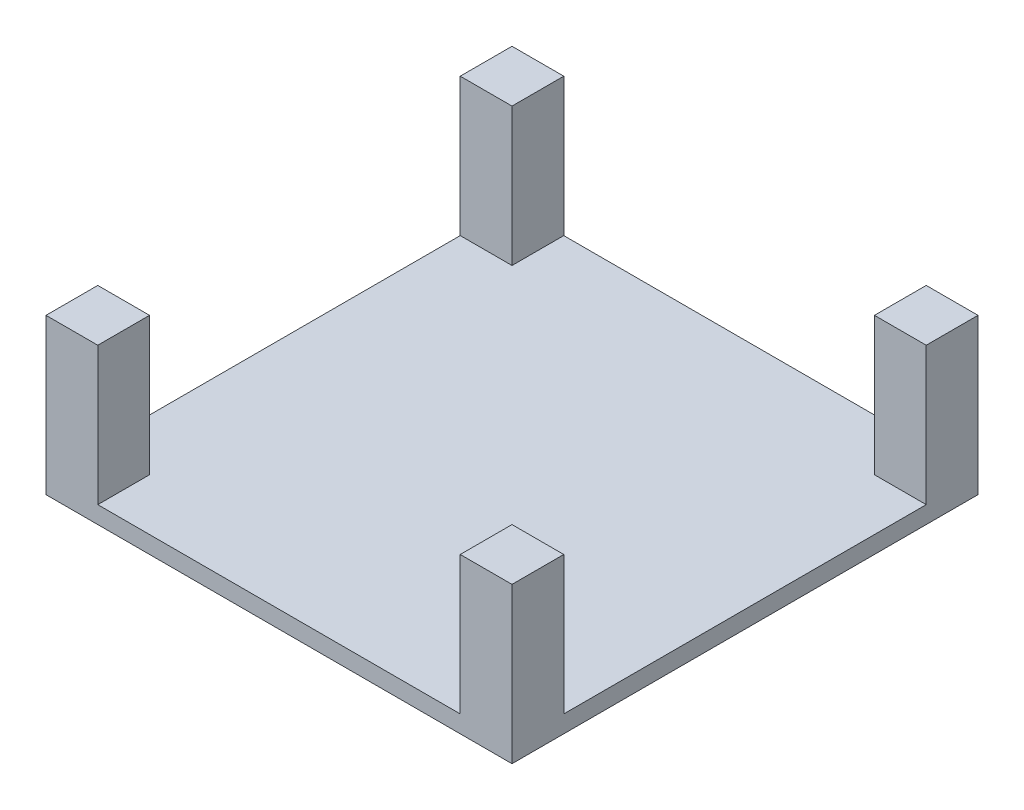
ISO-10303-21;
HEADER;
FILE_DESCRIPTION(('STEP AP214'),'2;1');
FILE_NAME('part.step','',(''),(''),'','','');
FILE_SCHEMA(('AUTOMOTIVE_DESIGN { 1 0 10303 214 1 1 1 1 }'));
ENDSEC;
DATA;
#1=APPLICATION_CONTEXT('core data for automotive mechanical design processes');
#2=APPLICATION_PROTOCOL_DEFINITION('international standard','automotive_design',2000,#1);
#3=PRODUCT_CONTEXT('',#1,'mechanical');
#4=PRODUCT('Part','Part','',(#3));
#5=PRODUCT_RELATED_PRODUCT_CATEGORY('part','',(#4));
#6=PRODUCT_DEFINITION_FORMATION('','',#4);
#7=PRODUCT_DEFINITION_CONTEXT('part definition',#1,'design');
#8=PRODUCT_DEFINITION('design','',#6,#7);
#9=PRODUCT_DEFINITION_SHAPE('','',#8);
#10=(LENGTH_UNIT() NAMED_UNIT(*) SI_UNIT(.MILLI.,.METRE.));
#11=(NAMED_UNIT(*) PLANE_ANGLE_UNIT() SI_UNIT($,.RADIAN.));
#12=(NAMED_UNIT(*) SI_UNIT($,.STERADIAN.) SOLID_ANGLE_UNIT());
#13=UNCERTAINTY_MEASURE_WITH_UNIT(LENGTH_MEASURE(1.E-05),#10,'distance_accuracy_value','');
#14=(GEOMETRIC_REPRESENTATION_CONTEXT(3) GLOBAL_UNCERTAINTY_ASSIGNED_CONTEXT((#13)) GLOBAL_UNIT_ASSIGNED_CONTEXT((#10,
#11,#12)) REPRESENTATION_CONTEXT('',''));
#15=CARTESIAN_POINT('',(0.,0.,0.));
#16=DIRECTION('',(0.,0.,1.));
#17=DIRECTION('',(1.,0.,0.));
#18=AXIS2_PLACEMENT_3D('',#15,#16,#17);
#19=CARTESIAN_POINT('',(0.,5.,0.));
#20=DIRECTION('',(0.,-1.,0.));
#21=DIRECTION('',(0.,0.,-1.));
#22=AXIS2_PLACEMENT_3D('',#19,#20,#21);
#23=PLANE('',#22);
#24=DIRECTION('',(1.,0.,0.));
#25=VECTOR('',#24,1.);
#26=CARTESIAN_POINT('',(0.,5.,-120.));
#27=LINE('',#26,#25);
#28=CARTESIAN_POINT('',(0.,5.,-120.));
#29=VERTEX_POINT('',#28);
#30=CARTESIAN_POINT('',(15.,5.,-120.));
#31=VERTEX_POINT('',#30);
#32=EDGE_CURVE('E65',#29,#31,#27,.T.);
#33=ORIENTED_EDGE('',*,*,#32,.F.);
#34=DIRECTION('',(0.,0.,1.));
#35=VECTOR('',#34,1.);
#36=CARTESIAN_POINT('',(0.,5.,0.));
#37=LINE('',#36,#35);
#38=CARTESIAN_POINT('',(0.,5.,-15.));
#39=VERTEX_POINT('',#38);
#40=EDGE_CURVE('E297',#29,#39,#37,.T.);
#41=ORIENTED_EDGE('',*,*,#40,.T.);
#42=DIRECTION('',(-1.,0.,0.));
#43=VECTOR('',#42,1.);
#44=CARTESIAN_POINT('',(0.,5.,-15.));
#45=LINE('',#44,#43);
#46=CARTESIAN_POINT('',(15.,5.,-15.));
#47=VERTEX_POINT('',#46);
#48=EDGE_CURVE('E269',#47,#39,#45,.T.);
#49=ORIENTED_EDGE('',*,*,#48,.F.);
#50=DIRECTION('',(0.,0.,-1.));
#51=VECTOR('',#50,1.);
#52=CARTESIAN_POINT('',(15.,5.,0.));
#53=LINE('',#52,#51);
#54=CARTESIAN_POINT('',(15.,5.,0.));
#55=VERTEX_POINT('',#54);
#56=EDGE_CURVE('E251',#55,#47,#53,.T.);
#57=ORIENTED_EDGE('',*,*,#56,.F.);
#58=DIRECTION('',(1.,0.,0.));
#59=VECTOR('',#58,1.);
#60=CARTESIAN_POINT('',(0.,5.,0.));
#61=LINE('',#60,#59);
#62=CARTESIAN_POINT('',(120.,5.,0.));
#63=VERTEX_POINT('',#62);
#64=EDGE_CURVE('E300',#55,#63,#61,.T.);
#65=ORIENTED_EDGE('',*,*,#64,.T.);
#66=DIRECTION('',(0.,0.,1.));
#67=VECTOR('',#66,1.);
#68=CARTESIAN_POINT('',(120.,5.,0.));
#69=LINE('',#68,#67);
#70=CARTESIAN_POINT('',(120.,5.,-15.));
#71=VERTEX_POINT('',#70);
#72=EDGE_CURVE('E242',#71,#63,#69,.T.);
#73=ORIENTED_EDGE('',*,*,#72,.F.);
#74=DIRECTION('',(-1.,0.,0.));
#75=VECTOR('',#74,1.);
#76=CARTESIAN_POINT('',(135.,5.,-15.));
#77=LINE('',#76,#75);
#78=CARTESIAN_POINT('',(135.,5.,-15.));
#79=VERTEX_POINT('',#78);
#80=EDGE_CURVE('E246',#79,#71,#77,.T.);
#81=ORIENTED_EDGE('',*,*,#80,.F.);
#82=DIRECTION('',(0.,0.,-1.));
#83=VECTOR('',#82,1.);
#84=CARTESIAN_POINT('',(135.,5.,0.));
#85=LINE('',#84,#83);
#86=CARTESIAN_POINT('',(135.,5.,-120.));
#87=VERTEX_POINT('',#86);
#88=EDGE_CURVE('E303',#79,#87,#85,.T.);
#89=ORIENTED_EDGE('',*,*,#88,.T.);
#90=DIRECTION('',(1.,0.,0.));
#91=VECTOR('',#90,1.);
#92=CARTESIAN_POINT('',(135.,5.,-120.));
#93=LINE('',#92,#91);
#94=CARTESIAN_POINT('',(120.,5.,-120.));
#95=VERTEX_POINT('',#94);
#96=EDGE_CURVE('E208',#95,#87,#93,.T.);
#97=ORIENTED_EDGE('',*,*,#96,.F.);
#98=DIRECTION('',(0.,0.,1.));
#99=VECTOR('',#98,1.);
#100=CARTESIAN_POINT('',(120.,5.,-135.));
#101=LINE('',#100,#99);
#102=CARTESIAN_POINT('',(120.,5.,-135.));
#103=VERTEX_POINT('',#102);
#104=EDGE_CURVE('E212',#103,#95,#101,.T.);
#105=ORIENTED_EDGE('',*,*,#104,.F.);
#106=DIRECTION('',(-1.,0.,0.));
#107=VECTOR('',#106,1.);
#108=CARTESIAN_POINT('',(0.,5.,-135.));
#109=LINE('',#108,#107);
#110=CARTESIAN_POINT('',(15.,5.,-135.));
#111=VERTEX_POINT('',#110);
#112=EDGE_CURVE('E171',#103,#111,#109,.T.);
#113=ORIENTED_EDGE('',*,*,#112,.T.);
#114=DIRECTION('',(0.,0.,-1.));
#115=VECTOR('',#114,1.);
#116=CARTESIAN_POINT('',(15.,5.,-135.));
#117=LINE('',#116,#115);
#118=EDGE_CURVE('E61',#31,#111,#117,.T.);
#119=ORIENTED_EDGE('',*,*,#118,.F.);
#120=EDGE_LOOP('',(#33,#41,#49,#57,#65,#73,#81,#89,#97,#105,#113,#119));
#121=FACE_BOUND('',#120,.T.);
#122=ADVANCED_FACE('F45',(#121),#23,.F.);
#123=CARTESIAN_POINT('',(0.,5.,0.));
#124=DIRECTION('',(1.,0.,0.));
#125=DIRECTION('',(0.,0.,-1.));
#126=AXIS2_PLACEMENT_3D('',#123,#124,#125);
#127=PLANE('',#126);
#128=DIRECTION('',(0.,0.,1.));
#129=VECTOR('',#128,1.);
#130=CARTESIAN_POINT('',(0.,0.,0.));
#131=LINE('',#130,#129);
#132=CARTESIAN_POINT('',(0.,0.,-135.));
#133=VERTEX_POINT('',#132);
#134=CARTESIAN_POINT('',(0.,0.,0.));
#135=VERTEX_POINT('',#134);
#136=EDGE_CURVE('E296',#133,#135,#131,.T.);
#137=ORIENTED_EDGE('',*,*,#136,.T.);
#138=DIRECTION('',(0.,-1.,0.));
#139=VECTOR('',#138,1.);
#140=CARTESIAN_POINT('',(0.,5.,0.));
#141=LINE('',#140,#139);
#142=CARTESIAN_POINT('',(0.,45.,0.));
#143=VERTEX_POINT('',#142);
#144=EDGE_CURVE('E11',#143,#135,#141,.T.);
#145=ORIENTED_EDGE('',*,*,#144,.F.);
#146=DIRECTION('',(0.,0.,1.));
#147=VECTOR('',#146,1.);
#148=CARTESIAN_POINT('',(0.,45.,0.));
#149=LINE('',#148,#147);
#150=CARTESIAN_POINT('',(0.,45.,-15.));
#151=VERTEX_POINT('',#150);
#152=EDGE_CURVE('E264',#151,#143,#149,.T.);
#153=ORIENTED_EDGE('',*,*,#152,.F.);
#154=DIRECTION('',(0.,-1.,0.));
#155=VECTOR('',#154,1.);
#156=CARTESIAN_POINT('',(0.,45.,-15.));
#157=LINE('',#156,#155);
#158=EDGE_CURVE('E278',#151,#39,#157,.T.);
#159=ORIENTED_EDGE('',*,*,#158,.T.);
#160=ORIENTED_EDGE('',*,*,#40,.F.);
#161=DIRECTION('',(0.,-1.,0.));
#162=VECTOR('',#161,1.);
#163=CARTESIAN_POINT('',(0.,45.,-120.));
#164=LINE('',#163,#162);
#165=CARTESIAN_POINT('',(0.,45.,-120.));
#166=VERTEX_POINT('',#165);
#167=EDGE_CURVE('E185',#166,#29,#164,.T.);
#168=ORIENTED_EDGE('',*,*,#167,.F.);
#169=DIRECTION('',(0.,0.,1.));
#170=VECTOR('',#169,1.);
#171=CARTESIAN_POINT('',(0.,45.,-135.));
#172=LINE('',#171,#170);
#173=CARTESIAN_POINT('',(0.,45.,-135.));
#174=VERTEX_POINT('',#173);
#175=EDGE_CURVE('E176',#174,#166,#172,.T.);
#176=ORIENTED_EDGE('',*,*,#175,.F.);
#177=DIRECTION('',(0.,-1.,0.));
#178=VECTOR('',#177,1.);
#179=CARTESIAN_POINT('',(0.,5.,-135.));
#180=LINE('',#179,#178);
#181=EDGE_CURVE('E157',#174,#133,#180,.T.);
#182=ORIENTED_EDGE('',*,*,#181,.T.);
#183=EDGE_LOOP('',(#137,#145,#153,#159,#160,#168,#176,#182));
#184=FACE_BOUND('',#183,.T.);
#185=ADVANCED_FACE('F47',(#184),#127,.F.);
#186=CARTESIAN_POINT('',(0.,5.,0.));
#187=DIRECTION('',(0.,0.,-1.));
#188=DIRECTION('',(-1.,0.,0.));
#189=AXIS2_PLACEMENT_3D('',#186,#187,#188);
#190=PLANE('',#189);
#191=DIRECTION('',(1.,0.,0.));
#192=VECTOR('',#191,1.);
#193=CARTESIAN_POINT('',(0.,0.,0.));
#194=LINE('',#193,#192);
#195=CARTESIAN_POINT('',(135.,0.,0.));
#196=VERTEX_POINT('',#195);
#197=EDGE_CURVE('E310',#135,#196,#194,.T.);
#198=ORIENTED_EDGE('',*,*,#197,.T.);
#199=DIRECTION('',(0.,-1.,0.));
#200=VECTOR('',#199,1.);
#201=CARTESIAN_POINT('',(135.,5.,0.));
#202=LINE('',#201,#200);
#203=CARTESIAN_POINT('',(135.,45.,0.));
#204=VERTEX_POINT('',#203);
#205=EDGE_CURVE('E54',#204,#196,#202,.T.);
#206=ORIENTED_EDGE('',*,*,#205,.F.);
#207=DIRECTION('',(1.,0.,0.));
#208=VECTOR('',#207,1.);
#209=CARTESIAN_POINT('',(135.,45.,0.));
#210=LINE('',#209,#208);
#211=CARTESIAN_POINT('',(120.,45.,0.));
#212=VERTEX_POINT('',#211);
#213=EDGE_CURVE('E241',#212,#204,#210,.T.);
#214=ORIENTED_EDGE('',*,*,#213,.F.);
#215=DIRECTION('',(0.,-1.,0.));
#216=VECTOR('',#215,1.);
#217=CARTESIAN_POINT('',(120.,45.,0.));
#218=LINE('',#217,#216);
#219=EDGE_CURVE('E237',#212,#63,#218,.T.);
#220=ORIENTED_EDGE('',*,*,#219,.T.);
#221=ORIENTED_EDGE('',*,*,#64,.F.);
#222=DIRECTION('',(0.,-1.,0.));
#223=VECTOR('',#222,1.);
#224=CARTESIAN_POINT('',(15.,45.,0.));
#225=LINE('',#224,#223);
#226=CARTESIAN_POINT('',(15.,45.,0.));
#227=VERTEX_POINT('',#226);
#228=EDGE_CURVE('E292',#227,#55,#225,.T.);
#229=ORIENTED_EDGE('',*,*,#228,.F.);
#230=DIRECTION('',(1.,0.,0.));
#231=VECTOR('',#230,1.);
#232=CARTESIAN_POINT('',(0.,45.,0.));
#233=LINE('',#232,#231);
#234=EDGE_CURVE('E268',#143,#227,#233,.T.);
#235=ORIENTED_EDGE('',*,*,#234,.F.);
#236=ORIENTED_EDGE('',*,*,#144,.T.);
#237=EDGE_LOOP('',(#198,#206,#214,#220,#221,#229,#235,#236));
#238=FACE_BOUND('',#237,.T.);
#239=ADVANCED_FACE('F333',(#238),#190,.F.);
#240=CARTESIAN_POINT('',(135.,5.,0.));
#241=DIRECTION('',(-1.,0.,0.));
#242=DIRECTION('',(0.,0.,1.));
#243=AXIS2_PLACEMENT_3D('',#240,#241,#242);
#244=PLANE('',#243);
#245=DIRECTION('',(0.,0.,-1.));
#246=VECTOR('',#245,1.);
#247=CARTESIAN_POINT('',(135.,0.,0.));
#248=LINE('',#247,#246);
#249=CARTESIAN_POINT('',(135.,0.,-135.));
#250=VERTEX_POINT('',#249);
#251=EDGE_CURVE('E313',#196,#250,#248,.T.);
#252=ORIENTED_EDGE('',*,*,#251,.T.);
#253=DIRECTION('',(0.,-1.,0.));
#254=VECTOR('',#253,1.);
#255=CARTESIAN_POINT('',(135.,5.,-135.));
#256=LINE('',#255,#254);
#257=CARTESIAN_POINT('',(135.,45.,-135.));
#258=VERTEX_POINT('',#257);
#259=EDGE_CURVE('E170',#258,#250,#256,.T.);
#260=ORIENTED_EDGE('',*,*,#259,.F.);
#261=DIRECTION('',(0.,0.,-1.));
#262=VECTOR('',#261,1.);
#263=CARTESIAN_POINT('',(135.,45.,-135.));
#264=LINE('',#263,#262);
#265=CARTESIAN_POINT('',(135.,45.,-120.));
#266=VERTEX_POINT('',#265);
#267=EDGE_CURVE('E207',#266,#258,#264,.T.);
#268=ORIENTED_EDGE('',*,*,#267,.F.);
#269=DIRECTION('',(0.,-1.,0.));
#270=VECTOR('',#269,1.);
#271=CARTESIAN_POINT('',(135.,45.,-120.));
#272=LINE('',#271,#270);
#273=EDGE_CURVE('E203',#266,#87,#272,.T.);
#274=ORIENTED_EDGE('',*,*,#273,.T.);
#275=ORIENTED_EDGE('',*,*,#88,.F.);
#276=DIRECTION('',(0.,-1.,0.));
#277=VECTOR('',#276,1.);
#278=CARTESIAN_POINT('',(135.,45.,-15.));
#279=LINE('',#278,#277);
#280=CARTESIAN_POINT('',(135.,45.,-15.));
#281=VERTEX_POINT('',#280);
#282=EDGE_CURVE('E217',#281,#79,#279,.T.);
#283=ORIENTED_EDGE('',*,*,#282,.F.);
#284=DIRECTION('',(0.,0.,-1.));
#285=VECTOR('',#284,1.);
#286=CARTESIAN_POINT('',(135.,45.,0.));
#287=LINE('',#286,#285);
#288=EDGE_CURVE('E247',#204,#281,#287,.T.);
#289=ORIENTED_EDGE('',*,*,#288,.F.);
#290=ORIENTED_EDGE('',*,*,#205,.T.);
#291=EDGE_LOOP('',(#252,#260,#268,#274,#275,#283,#289,#290));
#292=FACE_BOUND('',#291,.T.);
#293=ADVANCED_FACE('F324',(#292),#244,.F.);
#294=CARTESIAN_POINT('',(0.,5.,-135.));
#295=DIRECTION('',(0.,0.,1.));
#296=DIRECTION('',(1.,0.,0.));
#297=AXIS2_PLACEMENT_3D('',#294,#295,#296);
#298=PLANE('',#297);
#299=DIRECTION('',(-1.,0.,0.));
#300=VECTOR('',#299,1.);
#301=CARTESIAN_POINT('',(0.,0.,-135.));
#302=LINE('',#301,#300);
#303=EDGE_CURVE('E164',#250,#133,#302,.T.);
#304=ORIENTED_EDGE('',*,*,#303,.T.);
#305=ORIENTED_EDGE('',*,*,#181,.F.);
#306=DIRECTION('',(-1.,0.,0.));
#307=VECTOR('',#306,1.);
#308=CARTESIAN_POINT('',(0.,45.,-135.));
#309=LINE('',#308,#307);
#310=CARTESIAN_POINT('',(15.,45.,-135.));
#311=VERTEX_POINT('',#310);
#312=EDGE_CURVE('E161',#311,#174,#309,.T.);
#313=ORIENTED_EDGE('',*,*,#312,.F.);
#314=DIRECTION('',(0.,-1.,0.));
#315=VECTOR('',#314,1.);
#316=CARTESIAN_POINT('',(15.,45.,-135.));
#317=LINE('',#316,#315);
#318=EDGE_CURVE('E182',#311,#111,#317,.T.);
#319=ORIENTED_EDGE('',*,*,#318,.T.);
#320=ORIENTED_EDGE('',*,*,#112,.F.);
#321=DIRECTION('',(0.,-1.,0.));
#322=VECTOR('',#321,1.);
#323=CARTESIAN_POINT('',(120.,45.,-135.));
#324=LINE('',#323,#322);
#325=CARTESIAN_POINT('',(120.,45.,-135.));
#326=VERTEX_POINT('',#325);
#327=EDGE_CURVE('E195',#326,#103,#324,.T.);
#328=ORIENTED_EDGE('',*,*,#327,.F.);
#329=DIRECTION('',(-1.,0.,0.));
#330=VECTOR('',#329,1.);
#331=CARTESIAN_POINT('',(135.,45.,-135.));
#332=LINE('',#331,#330);
#333=EDGE_CURVE('E213',#258,#326,#332,.T.);
#334=ORIENTED_EDGE('',*,*,#333,.F.);
#335=ORIENTED_EDGE('',*,*,#259,.T.);
#336=EDGE_LOOP('',(#304,#305,#313,#319,#320,#328,#334,#335));
#337=FACE_BOUND('',#336,.T.);
#338=ADVANCED_FACE('F159',(#337),#298,.F.);
#339=CARTESIAN_POINT('',(0.,0.,0.));
#340=DIRECTION('',(0.,-1.,0.));
#341=DIRECTION('',(0.,0.,-1.));
#342=AXIS2_PLACEMENT_3D('',#339,#340,#341);
#343=PLANE('',#342);
#344=ORIENTED_EDGE('',*,*,#136,.F.);
#345=ORIENTED_EDGE('',*,*,#303,.F.);
#346=ORIENTED_EDGE('',*,*,#251,.F.);
#347=ORIENTED_EDGE('',*,*,#197,.F.);
#348=EDGE_LOOP('',(#344,#345,#346,#347));
#349=FACE_BOUND('',#348,.T.);
#350=ADVANCED_FACE('F329',(#349),#343,.T.);
#351=CARTESIAN_POINT('',(15.,45.,0.));
#352=DIRECTION('',(-1.,0.,0.));
#353=DIRECTION('',(0.,0.,1.));
#354=AXIS2_PLACEMENT_3D('',#351,#352,#353);
#355=PLANE('',#354);
#356=ORIENTED_EDGE('',*,*,#56,.T.);
#357=DIRECTION('',(0.,-1.,0.));
#358=VECTOR('',#357,1.);
#359=CARTESIAN_POINT('',(15.,45.,-15.));
#360=LINE('',#359,#358);
#361=CARTESIAN_POINT('',(15.,45.,-15.));
#362=VERTEX_POINT('',#361);
#363=EDGE_CURVE('E288',#362,#47,#360,.T.);
#364=ORIENTED_EDGE('',*,*,#363,.F.);
#365=DIRECTION('',(0.,0.,-1.));
#366=VECTOR('',#365,1.);
#367=CARTESIAN_POINT('',(15.,45.,0.));
#368=LINE('',#367,#366);
#369=EDGE_CURVE('E272',#227,#362,#368,.T.);
#370=ORIENTED_EDGE('',*,*,#369,.F.);
#371=ORIENTED_EDGE('',*,*,#228,.T.);
#372=EDGE_LOOP('',(#356,#364,#370,#371));
#373=FACE_BOUND('',#372,.T.);
#374=ADVANCED_FACE('F378',(#373),#355,.F.);
#375=CARTESIAN_POINT('',(0.,45.,-15.));
#376=DIRECTION('',(0.,0.,1.));
#377=DIRECTION('',(1.,0.,0.));
#378=AXIS2_PLACEMENT_3D('',#375,#376,#377);
#379=PLANE('',#378);
#380=ORIENTED_EDGE('',*,*,#48,.T.);
#381=ORIENTED_EDGE('',*,*,#158,.F.);
#382=DIRECTION('',(-1.,0.,0.));
#383=VECTOR('',#382,1.);
#384=CARTESIAN_POINT('',(0.,45.,-15.));
#385=LINE('',#384,#383);
#386=EDGE_CURVE('E275',#362,#151,#385,.T.);
#387=ORIENTED_EDGE('',*,*,#386,.F.);
#388=ORIENTED_EDGE('',*,*,#363,.T.);
#389=EDGE_LOOP('',(#380,#381,#387,#388));
#390=FACE_BOUND('',#389,.T.);
#391=ADVANCED_FACE('F342',(#390),#379,.F.);
#392=CARTESIAN_POINT('',(0.,45.,0.));
#393=DIRECTION('',(0.,-1.,0.));
#394=DIRECTION('',(0.,0.,-1.));
#395=AXIS2_PLACEMENT_3D('',#392,#393,#394);
#396=PLANE('',#395);
#397=ORIENTED_EDGE('',*,*,#152,.T.);
#398=ORIENTED_EDGE('',*,*,#234,.T.);
#399=ORIENTED_EDGE('',*,*,#369,.T.);
#400=ORIENTED_EDGE('',*,*,#386,.T.);
#401=EDGE_LOOP('',(#397,#398,#399,#400));
#402=FACE_BOUND('',#401,.T.);
#403=ADVANCED_FACE('F337',(#402),#396,.F.);
#404=CARTESIAN_POINT('',(135.,45.,-15.));
#405=DIRECTION('',(0.,0.,1.));
#406=DIRECTION('',(1.,0.,0.));
#407=AXIS2_PLACEMENT_3D('',#404,#405,#406);
#408=PLANE('',#407);
#409=ORIENTED_EDGE('',*,*,#80,.T.);
#410=DIRECTION('',(0.,-1.,0.));
#411=VECTOR('',#410,1.);
#412=CARTESIAN_POINT('',(120.,45.,-15.));
#413=LINE('',#412,#411);
#414=CARTESIAN_POINT('',(120.,45.,-15.));
#415=VERTEX_POINT('',#414);
#416=EDGE_CURVE('E233',#415,#71,#413,.T.);
#417=ORIENTED_EDGE('',*,*,#416,.F.);
#418=DIRECTION('',(-1.,0.,0.));
#419=VECTOR('',#418,1.);
#420=CARTESIAN_POINT('',(135.,45.,-15.));
#421=LINE('',#420,#419);
#422=EDGE_CURVE('E258',#281,#415,#421,.T.);
#423=ORIENTED_EDGE('',*,*,#422,.F.);
#424=ORIENTED_EDGE('',*,*,#282,.T.);
#425=EDGE_LOOP('',(#409,#417,#423,#424));
#426=FACE_BOUND('',#425,.T.);
#427=ADVANCED_FACE('F419',(#426),#408,.F.);
#428=CARTESIAN_POINT('',(120.,45.,0.));
#429=DIRECTION('',(1.,0.,0.));
#430=DIRECTION('',(0.,0.,-1.));
#431=AXIS2_PLACEMENT_3D('',#428,#429,#430);
#432=PLANE('',#431);
#433=ORIENTED_EDGE('',*,*,#72,.T.);
#434=ORIENTED_EDGE('',*,*,#219,.F.);
#435=DIRECTION('',(0.,0.,1.));
#436=VECTOR('',#435,1.);
#437=CARTESIAN_POINT('',(120.,45.,0.));
#438=LINE('',#437,#436);
#439=EDGE_CURVE('E255',#415,#212,#438,.T.);
#440=ORIENTED_EDGE('',*,*,#439,.F.);
#441=ORIENTED_EDGE('',*,*,#416,.T.);
#442=EDGE_LOOP('',(#433,#434,#440,#441));
#443=FACE_BOUND('',#442,.T.);
#444=ADVANCED_FACE('F427',(#443),#432,.F.);
#445=CARTESIAN_POINT('',(0.,45.,0.));
#446=DIRECTION('',(0.,1.,0.));
#447=DIRECTION('',(0.,0.,1.));
#448=AXIS2_PLACEMENT_3D('',#445,#446,#447);
#449=PLANE('',#448);
#450=ORIENTED_EDGE('',*,*,#288,.T.);
#451=ORIENTED_EDGE('',*,*,#422,.T.);
#452=ORIENTED_EDGE('',*,*,#439,.T.);
#453=ORIENTED_EDGE('',*,*,#213,.T.);
#454=EDGE_LOOP('',(#450,#451,#452,#453));
#455=FACE_BOUND('',#454,.T.);
#456=ADVANCED_FACE('F436',(#455),#449,.T.);
#457=CARTESIAN_POINT('',(120.,45.,-135.));
#458=DIRECTION('',(1.,0.,0.));
#459=DIRECTION('',(0.,0.,-1.));
#460=AXIS2_PLACEMENT_3D('',#457,#458,#459);
#461=PLANE('',#460);
#462=ORIENTED_EDGE('',*,*,#104,.T.);
#463=DIRECTION('',(0.,-1.,0.));
#464=VECTOR('',#463,1.);
#465=CARTESIAN_POINT('',(120.,45.,-120.));
#466=LINE('',#465,#464);
#467=CARTESIAN_POINT('',(120.,45.,-120.));
#468=VERTEX_POINT('',#467);
#469=EDGE_CURVE('E199',#468,#95,#466,.T.);
#470=ORIENTED_EDGE('',*,*,#469,.F.);
#471=DIRECTION('',(0.,0.,1.));
#472=VECTOR('',#471,1.);
#473=CARTESIAN_POINT('',(120.,45.,-135.));
#474=LINE('',#473,#472);
#475=EDGE_CURVE('E224',#326,#468,#474,.T.);
#476=ORIENTED_EDGE('',*,*,#475,.F.);
#477=ORIENTED_EDGE('',*,*,#327,.T.);
#478=EDGE_LOOP('',(#462,#470,#476,#477));
#479=FACE_BOUND('',#478,.T.);
#480=ADVANCED_FACE('F445',(#479),#461,.F.);
#481=CARTESIAN_POINT('',(135.,45.,-120.));
#482=DIRECTION('',(0.,0.,-1.));
#483=DIRECTION('',(-1.,0.,0.));
#484=AXIS2_PLACEMENT_3D('',#481,#482,#483);
#485=PLANE('',#484);
#486=ORIENTED_EDGE('',*,*,#96,.T.);
#487=ORIENTED_EDGE('',*,*,#273,.F.);
#488=DIRECTION('',(1.,0.,0.));
#489=VECTOR('',#488,1.);
#490=CARTESIAN_POINT('',(135.,45.,-120.));
#491=LINE('',#490,#489);
#492=EDGE_CURVE('E221',#468,#266,#491,.T.);
#493=ORIENTED_EDGE('',*,*,#492,.F.);
#494=ORIENTED_EDGE('',*,*,#469,.T.);
#495=EDGE_LOOP('',(#486,#487,#493,#494));
#496=FACE_BOUND('',#495,.T.);
#497=ADVANCED_FACE('F454',(#496),#485,.F.);
#498=CARTESIAN_POINT('',(0.,45.,0.));
#499=DIRECTION('',(0.,1.,0.));
#500=DIRECTION('',(0.,0.,1.));
#501=AXIS2_PLACEMENT_3D('',#498,#499,#500);
#502=PLANE('',#501);
#503=ORIENTED_EDGE('',*,*,#333,.T.);
#504=ORIENTED_EDGE('',*,*,#475,.T.);
#505=ORIENTED_EDGE('',*,*,#492,.T.);
#506=ORIENTED_EDGE('',*,*,#267,.T.);
#507=EDGE_LOOP('',(#503,#504,#505,#506));
#508=FACE_BOUND('',#507,.T.);
#509=ADVANCED_FACE('F368',(#508),#502,.T.);
#510=CARTESIAN_POINT('',(0.,45.,-120.));
#511=DIRECTION('',(0.,0.,-1.));
#512=DIRECTION('',(-1.,0.,0.));
#513=AXIS2_PLACEMENT_3D('',#510,#511,#512);
#514=PLANE('',#513);
#515=ORIENTED_EDGE('',*,*,#32,.T.);
#516=DIRECTION('',(0.,-1.,0.));
#517=VECTOR('',#516,1.);
#518=CARTESIAN_POINT('',(15.,45.,-120.));
#519=LINE('',#518,#517);
#520=CARTESIAN_POINT('',(15.,45.,-120.));
#521=VERTEX_POINT('',#520);
#522=EDGE_CURVE('E348',#521,#31,#519,.T.);
#523=ORIENTED_EDGE('',*,*,#522,.F.);
#524=DIRECTION('',(1.,0.,0.));
#525=VECTOR('',#524,1.);
#526=CARTESIAN_POINT('',(0.,45.,-120.));
#527=LINE('',#526,#525);
#528=EDGE_CURVE('E187',#166,#521,#527,.T.);
#529=ORIENTED_EDGE('',*,*,#528,.F.);
#530=ORIENTED_EDGE('',*,*,#167,.T.);
#531=EDGE_LOOP('',(#515,#523,#529,#530));
#532=FACE_BOUND('',#531,.T.);
#533=ADVANCED_FACE('F344',(#532),#514,.F.);
#534=CARTESIAN_POINT('',(15.,45.,-135.));
#535=DIRECTION('',(-1.,0.,0.));
#536=DIRECTION('',(0.,0.,1.));
#537=AXIS2_PLACEMENT_3D('',#534,#535,#536);
#538=PLANE('',#537);
#539=ORIENTED_EDGE('',*,*,#118,.T.);
#540=ORIENTED_EDGE('',*,*,#318,.F.);
#541=DIRECTION('',(0.,0.,-1.));
#542=VECTOR('',#541,1.);
#543=CARTESIAN_POINT('',(15.,45.,-135.));
#544=LINE('',#543,#542);
#545=EDGE_CURVE('E179',#521,#311,#544,.T.);
#546=ORIENTED_EDGE('',*,*,#545,.F.);
#547=ORIENTED_EDGE('',*,*,#522,.T.);
#548=EDGE_LOOP('',(#539,#540,#546,#547));
#549=FACE_BOUND('',#548,.T.);
#550=ADVANCED_FACE('F360',(#549),#538,.F.);
#551=CARTESIAN_POINT('',(0.,45.,0.));
#552=DIRECTION('',(0.,1.,0.));
#553=DIRECTION('',(0.,0.,1.));
#554=AXIS2_PLACEMENT_3D('',#551,#552,#553);
#555=PLANE('',#554);
#556=ORIENTED_EDGE('',*,*,#175,.T.);
#557=ORIENTED_EDGE('',*,*,#528,.T.);
#558=ORIENTED_EDGE('',*,*,#545,.T.);
#559=ORIENTED_EDGE('',*,*,#312,.T.);
#560=EDGE_LOOP('',(#556,#557,#558,#559));
#561=FACE_BOUND('',#560,.T.);
#562=ADVANCED_FACE('F175',(#561),#555,.T.);
#563=CLOSED_SHELL('',(#122,#185,#239,#293,#338,#350,#374,#391,#403,#427,#444,#456,#480,#497,
#509,#533,#550,#562));
#564=MANIFOLD_SOLID_BREP('B2',#563);
#565=ADVANCED_BREP_SHAPE_REPRESENTATION('',(#18,#564),#14);
#566=SHAPE_DEFINITION_REPRESENTATION(#9,#565);
ENDSEC;
END-ISO-10303-21;
